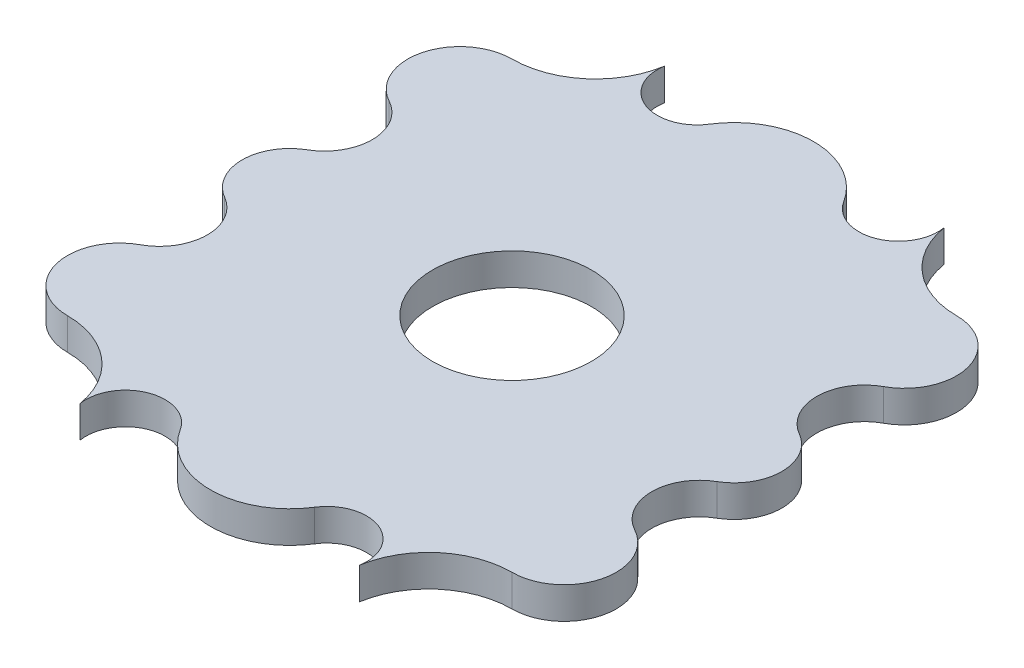
ISO-10303-21;
HEADER;
FILE_DESCRIPTION(('STEP AP214'),'2;1');
FILE_NAME('part.step','',(''),(''),'','','');
FILE_SCHEMA(('AUTOMOTIVE_DESIGN { 1 0 10303 214 1 1 1 1 }'));
ENDSEC;
DATA;
#1=APPLICATION_CONTEXT('core data for automotive mechanical design processes');
#2=APPLICATION_PROTOCOL_DEFINITION('international standard','automotive_design',2000,#1);
#3=PRODUCT_CONTEXT('',#1,'mechanical');
#4=PRODUCT('Part','Part','',(#3));
#5=PRODUCT_RELATED_PRODUCT_CATEGORY('part','',(#4));
#6=PRODUCT_DEFINITION_FORMATION('','',#4);
#7=PRODUCT_DEFINITION_CONTEXT('part definition',#1,'design');
#8=PRODUCT_DEFINITION('design','',#6,#7);
#9=PRODUCT_DEFINITION_SHAPE('','',#8);
#10=(LENGTH_UNIT() NAMED_UNIT(*) SI_UNIT(.MILLI.,.METRE.));
#11=(NAMED_UNIT(*) PLANE_ANGLE_UNIT() SI_UNIT($,.RADIAN.));
#12=(NAMED_UNIT(*) SI_UNIT($,.STERADIAN.) SOLID_ANGLE_UNIT());
#13=UNCERTAINTY_MEASURE_WITH_UNIT(LENGTH_MEASURE(1.E-05),#10,'distance_accuracy_value','');
#14=(GEOMETRIC_REPRESENTATION_CONTEXT(3) GLOBAL_UNCERTAINTY_ASSIGNED_CONTEXT((#13)) GLOBAL_UNIT_ASSIGNED_CONTEXT((#10,
#11,#12)) REPRESENTATION_CONTEXT('',''));
#15=CARTESIAN_POINT('',(0.,0.,0.));
#16=DIRECTION('',(0.,0.,1.));
#17=DIRECTION('',(1.,0.,0.));
#18=AXIS2_PLACEMENT_3D('',#15,#16,#17);
#19=CARTESIAN_POINT('',(70.,10.,-96.2922747821949));
#20=DIRECTION('',(0.,-1.,0.));
#21=DIRECTION('',(0.,0.,-1.));
#22=AXIS2_PLACEMENT_3D('',#19,#20,#21);
#23=CYLINDRICAL_SURFACE('',#22,26.2922747821949);
#24=CARTESIAN_POINT('',(70.,0.,-96.2922747821949));
#25=DIRECTION('',(0.,-1.,0.));
#26=DIRECTION('',(0.,0.,1.));
#27=AXIS2_PLACEMENT_3D('',#24,#25,#26);
#28=CIRCLE('',#27,26.2922747821949);
#29=CARTESIAN_POINT('',(70.,0.,-70.));
#30=VERTEX_POINT('',#29);
#31=CARTESIAN_POINT('',(44.0559087554756,0.,-92.0275540740791));
#32=VERTEX_POINT('',#31);
#33=EDGE_CURVE('E182',#30,#32,#28,.T.);
#34=ORIENTED_EDGE('',*,*,#33,.T.);
#35=DIRECTION('',(0.,-1.,0.));
#36=VECTOR('',#35,1.);
#37=CARTESIAN_POINT('',(44.0559087554756,10.,-92.0275540740791));
#38=LINE('',#37,#36);
#39=CARTESIAN_POINT('',(44.0559087554756,10.,-92.0275540740791));
#40=VERTEX_POINT('',#39);
#41=EDGE_CURVE('E12',#40,#32,#38,.T.);
#42=ORIENTED_EDGE('',*,*,#41,.F.);
#43=CARTESIAN_POINT('',(70.,10.,-96.2922747821949));
#44=DIRECTION('',(0.,-1.,0.));
#45=DIRECTION('',(0.,0.,1.));
#46=AXIS2_PLACEMENT_3D('',#43,#44,#45);
#47=CIRCLE('',#46,26.2922747821949);
#48=CARTESIAN_POINT('',(70.,10.,-70.));
#49=VERTEX_POINT('',#48);
#50=EDGE_CURVE('E78',#49,#40,#47,.T.);
#51=ORIENTED_EDGE('',*,*,#50,.F.);
#52=DIRECTION('',(0.,-1.,0.));
#53=VECTOR('',#52,1.);
#54=CARTESIAN_POINT('',(70.,10.,-70.));
#55=LINE('',#54,#53);
#56=EDGE_CURVE('E176',#49,#30,#55,.T.);
#57=ORIENTED_EDGE('',*,*,#56,.T.);
#58=EDGE_LOOP('',(#34,#42,#51,#57));
#59=FACE_BOUND('',#58,.T.);
#60=ADVANCED_FACE('F61',(#59),#23,.F.);
#61=CARTESIAN_POINT('',(31.7214438511238,10.,-90.));
#62=DIRECTION('',(0.,-1.,0.));
#63=DIRECTION('',(0.,0.,-1.));
#64=AXIS2_PLACEMENT_3D('',#61,#62,#63);
#65=CYLINDRICAL_SURFACE('',#64,12.5);
#66=CARTESIAN_POINT('',(31.7214438511238,0.,-90.));
#67=DIRECTION('',(0.,-1.,0.));
#68=DIRECTION('',(0.,0.,1.));
#69=AXIS2_PLACEMENT_3D('',#66,#67,#68);
#70=CIRCLE('',#69,12.5);
#71=CARTESIAN_POINT('',(21.1476292340825,0.,-83.3333333333333));
#72=VERTEX_POINT('',#71);
#73=EDGE_CURVE('E186',#32,#72,#70,.T.);
#74=ORIENTED_EDGE('',*,*,#73,.T.);
#75=DIRECTION('',(0.,-1.,0.));
#76=VECTOR('',#75,1.);
#77=CARTESIAN_POINT('',(21.1476292340825,10.,-83.3333333333333));
#78=LINE('',#77,#76);
#79=CARTESIAN_POINT('',(21.1476292340825,10.,-83.3333333333333));
#80=VERTEX_POINT('',#79);
#81=EDGE_CURVE('E70',#80,#72,#78,.T.);
#82=ORIENTED_EDGE('',*,*,#81,.F.);
#83=CARTESIAN_POINT('',(31.7214438511238,10.,-90.));
#84=DIRECTION('',(0.,-1.,0.));
#85=DIRECTION('',(0.,0.,1.));
#86=AXIS2_PLACEMENT_3D('',#83,#84,#85);
#87=CIRCLE('',#86,12.5);
#88=EDGE_CURVE('E130',#40,#80,#87,.T.);
#89=ORIENTED_EDGE('',*,*,#88,.F.);
#90=ORIENTED_EDGE('',*,*,#41,.T.);
#91=EDGE_LOOP('',(#74,#82,#89,#90));
#92=FACE_BOUND('',#91,.T.);
#93=ADVANCED_FACE('F415',(#92),#65,.F.);
#94=CARTESIAN_POINT('',(0.,10.,-70.));
#95=DIRECTION('',(0.,-1.,0.));
#96=DIRECTION('',(0.,0.,-1.));
#97=AXIS2_PLACEMENT_3D('',#94,#95,#96);
#98=CYLINDRICAL_SURFACE('',#97,25.);
#99=CARTESIAN_POINT('',(0.,0.,-70.));
#100=DIRECTION('',(0.,1.,0.));
#101=DIRECTION('',(0.,0.,-1.));
#102=AXIS2_PLACEMENT_3D('',#99,#100,#101);
#103=CIRCLE('',#102,25.);
#104=CARTESIAN_POINT('',(-21.1476292340825,0.,-83.3333333333333));
#105=VERTEX_POINT('',#104);
#106=EDGE_CURVE('E190',#72,#105,#103,.T.);
#107=ORIENTED_EDGE('',*,*,#106,.T.);
#108=DIRECTION('',(0.,-1.,0.));
#109=VECTOR('',#108,1.);
#110=CARTESIAN_POINT('',(-21.1476292340825,10.,-83.3333333333333));
#111=LINE('',#110,#109);
#112=CARTESIAN_POINT('',(-21.1476292340825,10.,-83.3333333333333));
#113=VERTEX_POINT('',#112);
#114=EDGE_CURVE('E236',#113,#105,#111,.T.);
#115=ORIENTED_EDGE('',*,*,#114,.F.);
#116=CARTESIAN_POINT('',(0.,10.,-70.));
#117=DIRECTION('',(0.,1.,0.));
#118=DIRECTION('',(0.,0.,-1.));
#119=AXIS2_PLACEMENT_3D('',#116,#117,#118);
#120=CIRCLE('',#119,25.);
#121=EDGE_CURVE('E246',#80,#113,#120,.T.);
#122=ORIENTED_EDGE('',*,*,#121,.F.);
#123=ORIENTED_EDGE('',*,*,#81,.T.);
#124=EDGE_LOOP('',(#107,#115,#122,#123));
#125=FACE_BOUND('',#124,.T.);
#126=ADVANCED_FACE('F244',(#125),#98,.T.);
#127=CARTESIAN_POINT('',(-31.7214438511238,10.,-90.));
#128=DIRECTION('',(0.,-1.,0.));
#129=DIRECTION('',(0.,0.,-1.));
#130=AXIS2_PLACEMENT_3D('',#127,#128,#129);
#131=CYLINDRICAL_SURFACE('',#130,12.5);
#132=CARTESIAN_POINT('',(-31.7214438511238,0.,-90.));
#133=DIRECTION('',(0.,-1.,0.));
#134=DIRECTION('',(0.,0.,-1.));
#135=AXIS2_PLACEMENT_3D('',#132,#133,#134);
#136=CIRCLE('',#135,12.5);
#137=CARTESIAN_POINT('',(-44.0559087554755,0.,-92.0275540740791));
#138=VERTEX_POINT('',#137);
#139=EDGE_CURVE('E193',#105,#138,#136,.T.);
#140=ORIENTED_EDGE('',*,*,#139,.T.);
#141=DIRECTION('',(0.,-1.,0.));
#142=VECTOR('',#141,1.);
#143=CARTESIAN_POINT('',(-44.0559087554755,10.,-92.0275540740791));
#144=LINE('',#143,#142);
#145=CARTESIAN_POINT('',(-44.0559087554755,10.,-92.0275540740791));
#146=VERTEX_POINT('',#145);
#147=EDGE_CURVE('E232',#146,#138,#144,.T.);
#148=ORIENTED_EDGE('',*,*,#147,.F.);
#149=CARTESIAN_POINT('',(-31.7214438511238,10.,-90.));
#150=DIRECTION('',(0.,-1.,0.));
#151=DIRECTION('',(0.,0.,-1.));
#152=AXIS2_PLACEMENT_3D('',#149,#150,#151);
#153=CIRCLE('',#152,12.5);
#154=EDGE_CURVE('E266',#113,#146,#153,.T.);
#155=ORIENTED_EDGE('',*,*,#154,.F.);
#156=ORIENTED_EDGE('',*,*,#114,.T.);
#157=EDGE_LOOP('',(#140,#148,#155,#156));
#158=FACE_BOUND('',#157,.T.);
#159=ADVANCED_FACE('F255',(#158),#131,.F.);
#160=CARTESIAN_POINT('',(-70.,10.,-96.2922747821949));
#161=DIRECTION('',(0.,-1.,0.));
#162=DIRECTION('',(0.,0.,-1.));
#163=AXIS2_PLACEMENT_3D('',#160,#161,#162);
#164=CYLINDRICAL_SURFACE('',#163,26.2922747821949);
#165=CARTESIAN_POINT('',(-70.,0.,-96.2922747821949));
#166=DIRECTION('',(0.,-1.,0.));
#167=DIRECTION('',(0.,0.,-1.));
#168=AXIS2_PLACEMENT_3D('',#165,#166,#167);
#169=CIRCLE('',#168,26.2922747821949);
#170=CARTESIAN_POINT('',(-70.,0.,-70.));
#171=VERTEX_POINT('',#170);
#172=EDGE_CURVE('E196',#138,#171,#169,.T.);
#173=ORIENTED_EDGE('',*,*,#172,.T.);
#174=DIRECTION('',(0.,-1.,0.));
#175=VECTOR('',#174,1.);
#176=CARTESIAN_POINT('',(-70.,10.,-70.));
#177=LINE('',#176,#175);
#178=CARTESIAN_POINT('',(-70.,10.,-70.));
#179=VERTEX_POINT('',#178);
#180=EDGE_CURVE('E228',#179,#171,#177,.T.);
#181=ORIENTED_EDGE('',*,*,#180,.F.);
#182=CARTESIAN_POINT('',(-70.,10.,-96.2922747821949));
#183=DIRECTION('',(0.,-1.,0.));
#184=DIRECTION('',(0.,0.,-1.));
#185=AXIS2_PLACEMENT_3D('',#182,#183,#184);
#186=CIRCLE('',#185,26.2922747821949);
#187=EDGE_CURVE('E261',#146,#179,#186,.T.);
#188=ORIENTED_EDGE('',*,*,#187,.F.);
#189=ORIENTED_EDGE('',*,*,#147,.T.);
#190=EDGE_LOOP('',(#173,#181,#188,#189));
#191=FACE_BOUND('',#190,.T.);
#192=ADVANCED_FACE('F259',(#191),#164,.F.);
#193=CARTESIAN_POINT('',(-70.,10.,96.2922747821949));
#194=DIRECTION('',(0.,-1.,0.));
#195=DIRECTION('',(0.,0.,-1.));
#196=AXIS2_PLACEMENT_3D('',#193,#194,#195);
#197=CYLINDRICAL_SURFACE('',#196,26.2922747821949);
#198=CARTESIAN_POINT('',(-70.,0.,96.2922747821949));
#199=DIRECTION('',(0.,-1.,0.));
#200=DIRECTION('',(0.,0.,1.));
#201=AXIS2_PLACEMENT_3D('',#198,#199,#200);
#202=CIRCLE('',#201,26.2922747821949);
#203=CARTESIAN_POINT('',(-70.,0.,70.));
#204=VERTEX_POINT('',#203);
#205=CARTESIAN_POINT('',(-44.0559087554755,0.,92.0275540740791));
#206=VERTEX_POINT('',#205);
#207=EDGE_CURVE('E199',#204,#206,#202,.T.);
#208=ORIENTED_EDGE('',*,*,#207,.T.);
#209=DIRECTION('',(0.,-1.,0.));
#210=VECTOR('',#209,1.);
#211=CARTESIAN_POINT('',(-44.0559087554755,10.,92.0275540740791));
#212=LINE('',#211,#210);
#213=CARTESIAN_POINT('',(-44.0559087554755,10.,92.0275540740791));
#214=VERTEX_POINT('',#213);
#215=EDGE_CURVE('E220',#214,#206,#212,.T.);
#216=ORIENTED_EDGE('',*,*,#215,.F.);
#217=CARTESIAN_POINT('',(-70.,10.,96.2922747821949));
#218=DIRECTION('',(0.,-1.,0.));
#219=DIRECTION('',(0.,0.,1.));
#220=AXIS2_PLACEMENT_3D('',#217,#218,#219);
#221=CIRCLE('',#220,26.2922747821949);
#222=CARTESIAN_POINT('',(-70.,10.,70.));
#223=VERTEX_POINT('',#222);
#224=EDGE_CURVE('E265',#223,#214,#221,.T.);
#225=ORIENTED_EDGE('',*,*,#224,.F.);
#226=DIRECTION('',(0.,-1.,0.));
#227=VECTOR('',#226,1.);
#228=CARTESIAN_POINT('',(-70.,10.,70.));
#229=LINE('',#228,#227);
#230=EDGE_CURVE('E224',#223,#204,#229,.T.);
#231=ORIENTED_EDGE('',*,*,#230,.T.);
#232=EDGE_LOOP('',(#208,#216,#225,#231));
#233=FACE_BOUND('',#232,.T.);
#234=ADVANCED_FACE('F427',(#233),#197,.F.);
#235=CARTESIAN_POINT('',(-31.7214438511238,10.,90.));
#236=DIRECTION('',(0.,-1.,0.));
#237=DIRECTION('',(0.,0.,-1.));
#238=AXIS2_PLACEMENT_3D('',#235,#236,#237);
#239=CYLINDRICAL_SURFACE('',#238,12.5);
#240=CARTESIAN_POINT('',(-31.7214438511238,0.,90.));
#241=DIRECTION('',(0.,-1.,0.));
#242=DIRECTION('',(0.,0.,1.));
#243=AXIS2_PLACEMENT_3D('',#240,#241,#242);
#244=CIRCLE('',#243,12.5);
#245=CARTESIAN_POINT('',(-21.1476292340825,0.,83.3333333333333));
#246=VERTEX_POINT('',#245);
#247=EDGE_CURVE('E202',#206,#246,#244,.T.);
#248=ORIENTED_EDGE('',*,*,#247,.T.);
#249=DIRECTION('',(0.,-1.,0.));
#250=VECTOR('',#249,1.);
#251=CARTESIAN_POINT('',(-21.1476292340825,10.,83.3333333333333));
#252=LINE('',#251,#250);
#253=CARTESIAN_POINT('',(-21.1476292340825,10.,83.3333333333333));
#254=VERTEX_POINT('',#253);
#255=EDGE_CURVE('E216',#254,#246,#252,.T.);
#256=ORIENTED_EDGE('',*,*,#255,.F.);
#257=CARTESIAN_POINT('',(-31.7214438511238,10.,90.));
#258=DIRECTION('',(0.,-1.,0.));
#259=DIRECTION('',(0.,0.,1.));
#260=AXIS2_PLACEMENT_3D('',#257,#258,#259);
#261=CIRCLE('',#260,12.5);
#262=EDGE_CURVE('E270',#214,#254,#261,.T.);
#263=ORIENTED_EDGE('',*,*,#262,.F.);
#264=ORIENTED_EDGE('',*,*,#215,.T.);
#265=EDGE_LOOP('',(#248,#256,#263,#264));
#266=FACE_BOUND('',#265,.T.);
#267=ADVANCED_FACE('F283',(#266),#239,.F.);
#268=CARTESIAN_POINT('',(0.,10.,70.));
#269=DIRECTION('',(0.,-1.,0.));
#270=DIRECTION('',(0.,0.,-1.));
#271=AXIS2_PLACEMENT_3D('',#268,#269,#270);
#272=CYLINDRICAL_SURFACE('',#271,25.);
#273=CARTESIAN_POINT('',(0.,0.,70.));
#274=DIRECTION('',(0.,1.,0.));
#275=DIRECTION('',(0.,0.,1.));
#276=AXIS2_PLACEMENT_3D('',#273,#274,#275);
#277=CIRCLE('',#276,25.);
#278=CARTESIAN_POINT('',(21.1476292340825,0.,83.3333333333333));
#279=VERTEX_POINT('',#278);
#280=EDGE_CURVE('E205',#246,#279,#277,.T.);
#281=ORIENTED_EDGE('',*,*,#280,.T.);
#282=DIRECTION('',(0.,-1.,0.));
#283=VECTOR('',#282,1.);
#284=CARTESIAN_POINT('',(21.1476292340825,10.,83.3333333333333));
#285=LINE('',#284,#283);
#286=CARTESIAN_POINT('',(21.1476292340825,10.,83.3333333333333));
#287=VERTEX_POINT('',#286);
#288=EDGE_CURVE('E169',#287,#279,#285,.T.);
#289=ORIENTED_EDGE('',*,*,#288,.F.);
#290=CARTESIAN_POINT('',(0.,10.,70.));
#291=DIRECTION('',(0.,1.,0.));
#292=DIRECTION('',(0.,0.,1.));
#293=AXIS2_PLACEMENT_3D('',#290,#291,#292);
#294=CIRCLE('',#293,25.);
#295=EDGE_CURVE('E162',#254,#287,#294,.T.);
#296=ORIENTED_EDGE('',*,*,#295,.F.);
#297=ORIENTED_EDGE('',*,*,#255,.T.);
#298=EDGE_LOOP('',(#281,#289,#296,#297));
#299=FACE_BOUND('',#298,.T.);
#300=ADVANCED_FACE('F287',(#299),#272,.T.);
#301=CARTESIAN_POINT('',(31.7214438511238,10.,90.));
#302=DIRECTION('',(0.,-1.,0.));
#303=DIRECTION('',(0.,0.,-1.));
#304=AXIS2_PLACEMENT_3D('',#301,#302,#303);
#305=CYLINDRICAL_SURFACE('',#304,12.5);
#306=CARTESIAN_POINT('',(31.7214438511238,0.,90.));
#307=DIRECTION('',(0.,-1.,0.));
#308=DIRECTION('',(0.,0.,-1.));
#309=AXIS2_PLACEMENT_3D('',#306,#307,#308);
#310=CIRCLE('',#309,12.5);
#311=CARTESIAN_POINT('',(44.0559087554756,0.,92.0275540740791));
#312=VERTEX_POINT('',#311);
#313=EDGE_CURVE('E115',#279,#312,#310,.T.);
#314=ORIENTED_EDGE('',*,*,#313,.T.);
#315=DIRECTION('',(0.,-1.,0.));
#316=VECTOR('',#315,1.);
#317=CARTESIAN_POINT('',(44.0559087554756,10.,92.0275540740791));
#318=LINE('',#317,#316);
#319=CARTESIAN_POINT('',(44.0559087554756,10.,92.0275540740791));
#320=VERTEX_POINT('',#319);
#321=EDGE_CURVE('E166',#320,#312,#318,.T.);
#322=ORIENTED_EDGE('',*,*,#321,.F.);
#323=CARTESIAN_POINT('',(31.7214438511238,10.,90.));
#324=DIRECTION('',(0.,-1.,0.));
#325=DIRECTION('',(0.,0.,-1.));
#326=AXIS2_PLACEMENT_3D('',#323,#324,#325);
#327=CIRCLE('',#326,12.5);
#328=EDGE_CURVE('E156',#287,#320,#327,.T.);
#329=ORIENTED_EDGE('',*,*,#328,.F.);
#330=ORIENTED_EDGE('',*,*,#288,.T.);
#331=EDGE_LOOP('',(#314,#322,#329,#330));
#332=FACE_BOUND('',#331,.T.);
#333=ADVANCED_FACE('F167',(#332),#305,.F.);
#334=CARTESIAN_POINT('',(70.,10.,96.2922747821949));
#335=DIRECTION('',(0.,-1.,0.));
#336=DIRECTION('',(0.,0.,-1.));
#337=AXIS2_PLACEMENT_3D('',#334,#335,#336);
#338=CYLINDRICAL_SURFACE('',#337,26.2922747821949);
#339=CARTESIAN_POINT('',(70.,0.,96.2922747821949));
#340=DIRECTION('',(0.,-1.,0.));
#341=DIRECTION('',(0.,0.,-1.));
#342=AXIS2_PLACEMENT_3D('',#339,#340,#341);
#343=CIRCLE('',#342,26.2922747821949);
#344=CARTESIAN_POINT('',(70.,0.,70.));
#345=VERTEX_POINT('',#344);
#346=EDGE_CURVE('E122',#312,#345,#343,.T.);
#347=ORIENTED_EDGE('',*,*,#346,.T.);
#348=DIRECTION('',(0.,-1.,0.));
#349=VECTOR('',#348,1.);
#350=CARTESIAN_POINT('',(70.,10.,70.));
#351=LINE('',#350,#349);
#352=CARTESIAN_POINT('',(70.,10.,70.));
#353=VERTEX_POINT('',#352);
#354=EDGE_CURVE('E170',#353,#345,#351,.T.);
#355=ORIENTED_EDGE('',*,*,#354,.F.);
#356=CARTESIAN_POINT('',(70.,10.,96.2922747821949));
#357=DIRECTION('',(0.,-1.,0.));
#358=DIRECTION('',(0.,0.,-1.));
#359=AXIS2_PLACEMENT_3D('',#356,#357,#358);
#360=CIRCLE('',#359,26.2922747821949);
#361=EDGE_CURVE('E160',#320,#353,#360,.T.);
#362=ORIENTED_EDGE('',*,*,#361,.F.);
#363=ORIENTED_EDGE('',*,*,#321,.T.);
#364=EDGE_LOOP('',(#347,#355,#362,#363));
#365=FACE_BOUND('',#364,.T.);
#366=ADVANCED_FACE('F172',(#365),#338,.F.);
#367=CARTESIAN_POINT('',(70.,10.,-96.2922747821949));
#368=DIRECTION('',(0.,1.,0.));
#369=DIRECTION('',(0.,0.,1.));
#370=AXIS2_PLACEMENT_3D('',#367,#368,#369);
#371=PLANE('',#370);
#372=CARTESIAN_POINT('',(0.,10.,0.));
#373=DIRECTION('',(0.,1.,0.));
#374=DIRECTION('',(0.,0.,1.));
#375=AXIS2_PLACEMENT_3D('',#372,#373,#374);
#376=CIRCLE('',#375,25.);
#377=CARTESIAN_POINT('',(0.,10.,25.));
#378=VERTEX_POINT('',#377);
#379=EDGE_CURVE('E313',#378,#378,#376,.T.);
#380=ORIENTED_EDGE('',*,*,#379,.F.);
#381=EDGE_LOOP('',(#380));
#382=FACE_BOUND('',#381,.T.);
#383=ORIENTED_EDGE('',*,*,#50,.T.);
#384=ORIENTED_EDGE('',*,*,#88,.T.);
#385=ORIENTED_EDGE('',*,*,#121,.T.);
#386=ORIENTED_EDGE('',*,*,#154,.T.);
#387=ORIENTED_EDGE('',*,*,#187,.T.);
#388=CARTESIAN_POINT('',(-70.,10.,-53.5842229288624));
#389=DIRECTION('',(0.,1.,0.));
#390=DIRECTION('',(0.,0.,1.));
#391=AXIS2_PLACEMENT_3D('',#388,#389,#390);
#392=CIRCLE('',#391,16.4157770711376);
#393=CARTESIAN_POINT('',(-77.8379934868232,10.,-39.1605065232405));
#394=VERTEX_POINT('',#393);
#395=EDGE_CURVE('E392',#394,#179,#392,.F.);
#396=ORIENTED_EDGE('',*,*,#395,.F.);
#397=CARTESIAN_POINT('',(-85.,10.,-25.9807621135331));
#398=DIRECTION('',(0.,1.,0.));
#399=DIRECTION('',(0.,0.,1.));
#400=AXIS2_PLACEMENT_3D('',#397,#398,#399);
#401=CIRCLE('',#400,15.);
#402=CARTESIAN_POINT('',(-77.5,10.,-12.9903810567666));
#403=VERTEX_POINT('',#402);
#404=EDGE_CURVE('E397',#394,#403,#401,.F.);
#405=ORIENTED_EDGE('',*,*,#404,.T.);
#406=CARTESIAN_POINT('',(-70.,10.,0.));
#407=DIRECTION('',(0.,1.,0.));
#408=DIRECTION('',(0.,0.,1.));
#409=AXIS2_PLACEMENT_3D('',#406,#407,#408);
#410=CIRCLE('',#409,15.);
#411=CARTESIAN_POINT('',(-77.5,10.,12.9903810567666));
#412=VERTEX_POINT('',#411);
#413=EDGE_CURVE('E337',#412,#403,#410,.F.);
#414=ORIENTED_EDGE('',*,*,#413,.F.);
#415=CARTESIAN_POINT('',(-85.,10.,25.9807621135332));
#416=DIRECTION('',(0.,1.,0.));
#417=DIRECTION('',(0.,0.,1.));
#418=AXIS2_PLACEMENT_3D('',#415,#416,#417);
#419=CIRCLE('',#418,15.);
#420=CARTESIAN_POINT('',(-77.8379934868231,10.,39.1605065232405));
#421=VERTEX_POINT('',#420);
#422=EDGE_CURVE('E324',#421,#412,#419,.T.);
#423=ORIENTED_EDGE('',*,*,#422,.F.);
#424=CARTESIAN_POINT('',(-70.,10.,53.5842229288624));
#425=DIRECTION('',(0.,1.,0.));
#426=DIRECTION('',(0.,0.,1.));
#427=AXIS2_PLACEMENT_3D('',#424,#425,#426);
#428=CIRCLE('',#427,16.4157770711376);
#429=EDGE_CURVE('E321',#421,#223,#428,.T.);
#430=ORIENTED_EDGE('',*,*,#429,.T.);
#431=ORIENTED_EDGE('',*,*,#224,.T.);
#432=ORIENTED_EDGE('',*,*,#262,.T.);
#433=ORIENTED_EDGE('',*,*,#295,.T.);
#434=ORIENTED_EDGE('',*,*,#328,.T.);
#435=ORIENTED_EDGE('',*,*,#361,.T.);
#436=CARTESIAN_POINT('',(70.,10.,53.5842229288624));
#437=DIRECTION('',(0.,1.,0.));
#438=DIRECTION('',(0.,0.,1.));
#439=AXIS2_PLACEMENT_3D('',#436,#437,#438);
#440=CIRCLE('',#439,16.4157770711376);
#441=CARTESIAN_POINT('',(77.8379934868232,10.,39.1605065232405));
#442=VERTEX_POINT('',#441);
#443=EDGE_CURVE('E303',#442,#353,#440,.F.);
#444=ORIENTED_EDGE('',*,*,#443,.F.);
#445=CARTESIAN_POINT('',(85.,10.,25.9807621135332));
#446=DIRECTION('',(0.,1.,0.));
#447=DIRECTION('',(0.,0.,1.));
#448=AXIS2_PLACEMENT_3D('',#445,#446,#447);
#449=CIRCLE('',#448,15.);
#450=CARTESIAN_POINT('',(77.5000000000001,10.,12.9903810567666));
#451=VERTEX_POINT('',#450);
#452=EDGE_CURVE('E356',#442,#451,#449,.F.);
#453=ORIENTED_EDGE('',*,*,#452,.T.);
#454=CARTESIAN_POINT('',(70.,10.,0.));
#455=DIRECTION('',(0.,1.,0.));
#456=DIRECTION('',(0.,0.,1.));
#457=AXIS2_PLACEMENT_3D('',#454,#455,#456);
#458=CIRCLE('',#457,15.);
#459=CARTESIAN_POINT('',(77.5,10.,-12.9903810567666));
#460=VERTEX_POINT('',#459);
#461=EDGE_CURVE('E361',#451,#460,#458,.T.);
#462=ORIENTED_EDGE('',*,*,#461,.T.);
#463=CARTESIAN_POINT('',(85.,10.,-25.9807621135332));
#464=DIRECTION('',(0.,1.,0.));
#465=DIRECTION('',(0.,0.,1.));
#466=AXIS2_PLACEMENT_3D('',#463,#464,#465);
#467=CIRCLE('',#466,15.);
#468=CARTESIAN_POINT('',(77.8379934868232,10.,-39.1605065232405));
#469=VERTEX_POINT('',#468);
#470=EDGE_CURVE('E365',#469,#460,#467,.T.);
#471=ORIENTED_EDGE('',*,*,#470,.F.);
#472=CARTESIAN_POINT('',(70.,10.,-53.5842229288624));
#473=DIRECTION('',(0.,1.,0.));
#474=DIRECTION('',(0.,0.,1.));
#475=AXIS2_PLACEMENT_3D('',#472,#473,#474);
#476=CIRCLE('',#475,16.4157770711376);
#477=EDGE_CURVE('E378',#469,#49,#476,.T.);
#478=ORIENTED_EDGE('',*,*,#477,.T.);
#479=EDGE_LOOP('',(#383,#384,#385,#386,#387,#396,#405,#414,#423,#430,#431,#432,#433,#434,#435,
#444,#453,#462,#471,#478));
#480=FACE_BOUND('',#479,.T.);
#481=ADVANCED_FACE('F157',(#382,#480),#371,.T.);
#482=CARTESIAN_POINT('',(70.,0.,-96.2922747821949));
#483=DIRECTION('',(0.,1.,0.));
#484=DIRECTION('',(0.,0.,1.));
#485=AXIS2_PLACEMENT_3D('',#482,#483,#484);
#486=PLANE('',#485);
#487=CARTESIAN_POINT('',(0.,0.,0.));
#488=DIRECTION('',(0.,1.,0.));
#489=DIRECTION('',(0.,0.,1.));
#490=AXIS2_PLACEMENT_3D('',#487,#488,#489);
#491=CIRCLE('',#490,25.);
#492=CARTESIAN_POINT('',(0.,0.,25.));
#493=VERTEX_POINT('',#492);
#494=EDGE_CURVE('E307',#493,#493,#491,.T.);
#495=ORIENTED_EDGE('',*,*,#494,.T.);
#496=EDGE_LOOP('',(#495));
#497=FACE_BOUND('',#496,.T.);
#498=ORIENTED_EDGE('',*,*,#33,.F.);
#499=CARTESIAN_POINT('',(70.,0.,-53.5842229288624));
#500=DIRECTION('',(0.,1.,0.));
#501=DIRECTION('',(0.,0.,1.));
#502=AXIS2_PLACEMENT_3D('',#499,#500,#501);
#503=CIRCLE('',#502,16.4157770711376);
#504=CARTESIAN_POINT('',(77.8379934868232,0.,-39.1605065232405));
#505=VERTEX_POINT('',#504);
#506=EDGE_CURVE('E377',#505,#30,#503,.T.);
#507=ORIENTED_EDGE('',*,*,#506,.F.);
#508=CARTESIAN_POINT('',(85.,0.,-25.9807621135332));
#509=DIRECTION('',(0.,1.,0.));
#510=DIRECTION('',(0.,0.,1.));
#511=AXIS2_PLACEMENT_3D('',#508,#509,#510);
#512=CIRCLE('',#511,15.);
#513=CARTESIAN_POINT('',(77.5,0.,-12.9903810567666));
#514=VERTEX_POINT('',#513);
#515=EDGE_CURVE('E373',#505,#514,#512,.T.);
#516=ORIENTED_EDGE('',*,*,#515,.T.);
#517=CARTESIAN_POINT('',(70.,0.,0.));
#518=DIRECTION('',(0.,1.,0.));
#519=DIRECTION('',(0.,0.,1.));
#520=AXIS2_PLACEMENT_3D('',#517,#518,#519);
#521=CIRCLE('',#520,15.);
#522=CARTESIAN_POINT('',(77.5000000000001,0.,12.9903810567666));
#523=VERTEX_POINT('',#522);
#524=EDGE_CURVE('E351',#523,#514,#521,.T.);
#525=ORIENTED_EDGE('',*,*,#524,.F.);
#526=CARTESIAN_POINT('',(85.,0.,25.9807621135332));
#527=DIRECTION('',(0.,1.,0.));
#528=DIRECTION('',(0.,0.,1.));
#529=AXIS2_PLACEMENT_3D('',#526,#527,#528);
#530=CIRCLE('',#529,15.);
#531=CARTESIAN_POINT('',(77.8379934868232,0.,39.1605065232405));
#532=VERTEX_POINT('',#531);
#533=EDGE_CURVE('E294',#532,#523,#530,.F.);
#534=ORIENTED_EDGE('',*,*,#533,.F.);
#535=CARTESIAN_POINT('',(70.,0.,53.5842229288624));
#536=DIRECTION('',(0.,1.,0.));
#537=DIRECTION('',(0.,0.,1.));
#538=AXIS2_PLACEMENT_3D('',#535,#536,#537);
#539=CIRCLE('',#538,16.4157770711376);
#540=EDGE_CURVE('E290',#532,#345,#539,.F.);
#541=ORIENTED_EDGE('',*,*,#540,.T.);
#542=ORIENTED_EDGE('',*,*,#346,.F.);
#543=ORIENTED_EDGE('',*,*,#313,.F.);
#544=ORIENTED_EDGE('',*,*,#280,.F.);
#545=ORIENTED_EDGE('',*,*,#247,.F.);
#546=ORIENTED_EDGE('',*,*,#207,.F.);
#547=CARTESIAN_POINT('',(-70.,0.,53.5842229288624));
#548=DIRECTION('',(0.,1.,0.));
#549=DIRECTION('',(0.,0.,1.));
#550=AXIS2_PLACEMENT_3D('',#547,#548,#549);
#551=CIRCLE('',#550,16.4157770711376);
#552=CARTESIAN_POINT('',(-77.8379934868231,0.,39.1605065232405));
#553=VERTEX_POINT('',#552);
#554=EDGE_CURVE('E320',#553,#204,#551,.T.);
#555=ORIENTED_EDGE('',*,*,#554,.F.);
#556=CARTESIAN_POINT('',(-85.,0.,25.9807621135332));
#557=DIRECTION('',(0.,1.,0.));
#558=DIRECTION('',(0.,0.,1.));
#559=AXIS2_PLACEMENT_3D('',#556,#557,#558);
#560=CIRCLE('',#559,15.);
#561=CARTESIAN_POINT('',(-77.5,0.,12.9903810567666));
#562=VERTEX_POINT('',#561);
#563=EDGE_CURVE('E332',#553,#562,#560,.T.);
#564=ORIENTED_EDGE('',*,*,#563,.T.);
#565=CARTESIAN_POINT('',(-70.,0.,0.));
#566=DIRECTION('',(0.,1.,0.));
#567=DIRECTION('',(0.,0.,1.));
#568=AXIS2_PLACEMENT_3D('',#565,#566,#567);
#569=CIRCLE('',#568,15.);
#570=CARTESIAN_POINT('',(-77.5,0.,-12.9903810567666));
#571=VERTEX_POINT('',#570);
#572=EDGE_CURVE('E347',#562,#571,#569,.F.);
#573=ORIENTED_EDGE('',*,*,#572,.T.);
#574=CARTESIAN_POINT('',(-85.,0.,-25.9807621135331));
#575=DIRECTION('',(0.,1.,0.));
#576=DIRECTION('',(0.,0.,1.));
#577=AXIS2_PLACEMENT_3D('',#574,#575,#576);
#578=CIRCLE('',#577,15.);
#579=CARTESIAN_POINT('',(-77.8379934868232,0.,-39.1605065232405));
#580=VERTEX_POINT('',#579);
#581=EDGE_CURVE('E396',#580,#571,#578,.F.);
#582=ORIENTED_EDGE('',*,*,#581,.F.);
#583=CARTESIAN_POINT('',(-70.,0.,-53.5842229288624));
#584=DIRECTION('',(0.,1.,0.));
#585=DIRECTION('',(0.,0.,1.));
#586=AXIS2_PLACEMENT_3D('',#583,#584,#585);
#587=CIRCLE('',#586,16.4157770711376);
#588=EDGE_CURVE('E393',#580,#171,#587,.F.);
#589=ORIENTED_EDGE('',*,*,#588,.T.);
#590=ORIENTED_EDGE('',*,*,#172,.F.);
#591=ORIENTED_EDGE('',*,*,#139,.F.);
#592=ORIENTED_EDGE('',*,*,#106,.F.);
#593=ORIENTED_EDGE('',*,*,#73,.F.);
#594=EDGE_LOOP('',(#498,#507,#516,#525,#534,#541,#542,#543,#544,#545,#546,#555,#564,#573,#582,
#589,#590,#591,#592,#593));
#595=FACE_BOUND('',#594,.T.);
#596=ADVANCED_FACE('F250',(#497,#595),#486,.F.);
#597=CARTESIAN_POINT('',(-70.,0.,-53.5842229288624));
#598=DIRECTION('',(0.,1.,0.));
#599=DIRECTION('',(0.,0.,1.));
#600=AXIS2_PLACEMENT_3D('',#597,#598,#599);
#601=CYLINDRICAL_SURFACE('',#600,16.4157770711376);
#602=ORIENTED_EDGE('',*,*,#395,.T.);
#603=ORIENTED_EDGE('',*,*,#180,.T.);
#604=ORIENTED_EDGE('',*,*,#588,.F.);
#605=DIRECTION('',(0.,1.,0.));
#606=VECTOR('',#605,1.);
#607=CARTESIAN_POINT('',(-77.8379934868232,0.,-39.1605065232405));
#608=LINE('',#607,#606);
#609=EDGE_CURVE('E187',#580,#394,#608,.T.);
#610=ORIENTED_EDGE('',*,*,#609,.T.);
#611=EDGE_LOOP('',(#602,#603,#604,#610));
#612=FACE_BOUND('',#611,.T.);
#613=ADVANCED_FACE('F441',(#612),#601,.T.);
#614=CARTESIAN_POINT('',(-85.,0.,-25.9807621135331));
#615=DIRECTION('',(0.,1.,0.));
#616=DIRECTION('',(0.,0.,1.));
#617=AXIS2_PLACEMENT_3D('',#614,#615,#616);
#618=CYLINDRICAL_SURFACE('',#617,15.);
#619=ORIENTED_EDGE('',*,*,#404,.F.);
#620=ORIENTED_EDGE('',*,*,#609,.F.);
#621=ORIENTED_EDGE('',*,*,#581,.T.);
#622=DIRECTION('',(0.,1.,0.));
#623=VECTOR('',#622,1.);
#624=CARTESIAN_POINT('',(-77.5,0.,-12.9903810567666));
#625=LINE('',#624,#623);
#626=EDGE_CURVE('E328',#571,#403,#625,.T.);
#627=ORIENTED_EDGE('',*,*,#626,.T.);
#628=EDGE_LOOP('',(#619,#620,#621,#627));
#629=FACE_BOUND('',#628,.T.);
#630=ADVANCED_FACE('F448',(#629),#618,.F.);
#631=CARTESIAN_POINT('',(85.,0.,-25.9807621135332));
#632=DIRECTION('',(0.,1.,0.));
#633=DIRECTION('',(0.,0.,1.));
#634=AXIS2_PLACEMENT_3D('',#631,#632,#633);
#635=CYLINDRICAL_SURFACE('',#634,15.);
#636=ORIENTED_EDGE('',*,*,#470,.T.);
#637=DIRECTION('',(0.,1.,0.));
#638=VECTOR('',#637,1.);
#639=CARTESIAN_POINT('',(77.5,0.,-12.9903810567666));
#640=LINE('',#639,#638);
#641=EDGE_CURVE('E357',#514,#460,#640,.T.);
#642=ORIENTED_EDGE('',*,*,#641,.F.);
#643=ORIENTED_EDGE('',*,*,#515,.F.);
#644=DIRECTION('',(0.,1.,0.));
#645=VECTOR('',#644,1.);
#646=CARTESIAN_POINT('',(77.8379934868232,0.,-39.1605065232405));
#647=LINE('',#646,#645);
#648=EDGE_CURVE('E382',#505,#469,#647,.T.);
#649=ORIENTED_EDGE('',*,*,#648,.T.);
#650=EDGE_LOOP('',(#636,#642,#643,#649));
#651=FACE_BOUND('',#650,.T.);
#652=ADVANCED_FACE('F452',(#651),#635,.F.);
#653=CARTESIAN_POINT('',(70.,0.,-53.5842229288624));
#654=DIRECTION('',(0.,1.,0.));
#655=DIRECTION('',(0.,0.,1.));
#656=AXIS2_PLACEMENT_3D('',#653,#654,#655);
#657=CYLINDRICAL_SURFACE('',#656,16.4157770711376);
#658=ORIENTED_EDGE('',*,*,#477,.F.);
#659=ORIENTED_EDGE('',*,*,#648,.F.);
#660=ORIENTED_EDGE('',*,*,#506,.T.);
#661=ORIENTED_EDGE('',*,*,#56,.F.);
#662=EDGE_LOOP('',(#658,#659,#660,#661));
#663=FACE_BOUND('',#662,.T.);
#664=ADVANCED_FACE('F456',(#663),#657,.T.);
#665=CARTESIAN_POINT('',(70.,0.,0.));
#666=DIRECTION('',(0.,1.,0.));
#667=DIRECTION('',(0.,0.,1.));
#668=AXIS2_PLACEMENT_3D('',#665,#666,#667);
#669=CYLINDRICAL_SURFACE('',#668,15.);
#670=ORIENTED_EDGE('',*,*,#461,.F.);
#671=DIRECTION('',(0.,1.,0.));
#672=VECTOR('',#671,1.);
#673=CARTESIAN_POINT('',(77.5000000000001,0.,12.9903810567666));
#674=LINE('',#673,#672);
#675=EDGE_CURVE('E352',#523,#451,#674,.T.);
#676=ORIENTED_EDGE('',*,*,#675,.F.);
#677=ORIENTED_EDGE('',*,*,#524,.T.);
#678=ORIENTED_EDGE('',*,*,#641,.T.);
#679=EDGE_LOOP('',(#670,#676,#677,#678));
#680=FACE_BOUND('',#679,.T.);
#681=ADVANCED_FACE('F460',(#680),#669,.T.);
#682=CARTESIAN_POINT('',(85.,0.,25.9807621135332));
#683=DIRECTION('',(0.,1.,0.));
#684=DIRECTION('',(0.,0.,1.));
#685=AXIS2_PLACEMENT_3D('',#682,#683,#684);
#686=CYLINDRICAL_SURFACE('',#685,15.);
#687=ORIENTED_EDGE('',*,*,#452,.F.);
#688=DIRECTION('',(0.,1.,0.));
#689=VECTOR('',#688,1.);
#690=CARTESIAN_POINT('',(77.8379934868232,0.,39.1605065232405));
#691=LINE('',#690,#689);
#692=EDGE_CURVE('E300',#532,#442,#691,.T.);
#693=ORIENTED_EDGE('',*,*,#692,.F.);
#694=ORIENTED_EDGE('',*,*,#533,.T.);
#695=ORIENTED_EDGE('',*,*,#675,.T.);
#696=EDGE_LOOP('',(#687,#693,#694,#695));
#697=FACE_BOUND('',#696,.T.);
#698=ADVANCED_FACE('F464',(#697),#686,.F.);
#699=CARTESIAN_POINT('',(-85.,0.,25.9807621135332));
#700=DIRECTION('',(0.,1.,0.));
#701=DIRECTION('',(0.,0.,1.));
#702=AXIS2_PLACEMENT_3D('',#699,#700,#701);
#703=CYLINDRICAL_SURFACE('',#702,15.);
#704=ORIENTED_EDGE('',*,*,#422,.T.);
#705=DIRECTION('',(0.,1.,0.));
#706=VECTOR('',#705,1.);
#707=CARTESIAN_POINT('',(-77.5,0.,12.9903810567666));
#708=LINE('',#707,#706);
#709=EDGE_CURVE('E333',#562,#412,#708,.T.);
#710=ORIENTED_EDGE('',*,*,#709,.F.);
#711=ORIENTED_EDGE('',*,*,#563,.F.);
#712=DIRECTION('',(0.,1.,0.));
#713=VECTOR('',#712,1.);
#714=CARTESIAN_POINT('',(-77.8379934868231,0.,39.1605065232405));
#715=LINE('',#714,#713);
#716=EDGE_CURVE('E299',#553,#421,#715,.T.);
#717=ORIENTED_EDGE('',*,*,#716,.T.);
#718=EDGE_LOOP('',(#704,#710,#711,#717));
#719=FACE_BOUND('',#718,.T.);
#720=ADVANCED_FACE('F468',(#719),#703,.F.);
#721=CARTESIAN_POINT('',(-70.,0.,0.));
#722=DIRECTION('',(0.,1.,0.));
#723=DIRECTION('',(0.,0.,1.));
#724=AXIS2_PLACEMENT_3D('',#721,#722,#723);
#725=CYLINDRICAL_SURFACE('',#724,15.);
#726=ORIENTED_EDGE('',*,*,#413,.T.);
#727=ORIENTED_EDGE('',*,*,#626,.F.);
#728=ORIENTED_EDGE('',*,*,#572,.F.);
#729=ORIENTED_EDGE('',*,*,#709,.T.);
#730=EDGE_LOOP('',(#726,#727,#728,#729));
#731=FACE_BOUND('',#730,.T.);
#732=ADVANCED_FACE('F472',(#731),#725,.T.);
#733=CARTESIAN_POINT('',(-70.,0.,53.5842229288624));
#734=DIRECTION('',(0.,1.,0.));
#735=DIRECTION('',(0.,0.,1.));
#736=AXIS2_PLACEMENT_3D('',#733,#734,#735);
#737=CYLINDRICAL_SURFACE('',#736,16.4157770711376);
#738=ORIENTED_EDGE('',*,*,#429,.F.);
#739=ORIENTED_EDGE('',*,*,#716,.F.);
#740=ORIENTED_EDGE('',*,*,#554,.T.);
#741=ORIENTED_EDGE('',*,*,#230,.F.);
#742=EDGE_LOOP('',(#738,#739,#740,#741));
#743=FACE_BOUND('',#742,.T.);
#744=ADVANCED_FACE('F476',(#743),#737,.T.);
#745=CARTESIAN_POINT('',(70.,0.,53.5842229288624));
#746=DIRECTION('',(0.,1.,0.));
#747=DIRECTION('',(0.,0.,1.));
#748=AXIS2_PLACEMENT_3D('',#745,#746,#747);
#749=CYLINDRICAL_SURFACE('',#748,16.4157770711376);
#750=ORIENTED_EDGE('',*,*,#443,.T.);
#751=ORIENTED_EDGE('',*,*,#354,.T.);
#752=ORIENTED_EDGE('',*,*,#540,.F.);
#753=ORIENTED_EDGE('',*,*,#692,.T.);
#754=EDGE_LOOP('',(#750,#751,#752,#753));
#755=FACE_BOUND('',#754,.T.);
#756=ADVANCED_FACE('F302',(#755),#749,.T.);
#757=CARTESIAN_POINT('',(0.,0.,0.));
#758=DIRECTION('',(0.,1.,0.));
#759=DIRECTION('',(0.,0.,1.));
#760=AXIS2_PLACEMENT_3D('',#757,#758,#759);
#761=CYLINDRICAL_SURFACE('',#760,25.);
#762=ORIENTED_EDGE('',*,*,#494,.F.);
#763=EDGE_LOOP('',(#762));
#764=FACE_BOUND('',#763,.T.);
#765=ORIENTED_EDGE('',*,*,#379,.T.);
#766=EDGE_LOOP('',(#765));
#767=FACE_BOUND('',#766,.T.);
#768=ADVANCED_FACE('F483',(#764,#767),#761,.F.);
#769=CLOSED_SHELL('',(#60,#93,#126,#159,#192,#234,#267,#300,#333,#366,#481,#596,#613,#630,#652,
#664,#681,#698,#720,#732,#744,#756,#768));
#770=MANIFOLD_SOLID_BREP('B2',#769);
#771=ADVANCED_BREP_SHAPE_REPRESENTATION('',(#18,#770),#14);
#772=SHAPE_DEFINITION_REPRESENTATION(#9,#771);
ENDSEC;
END-ISO-10303-21;
